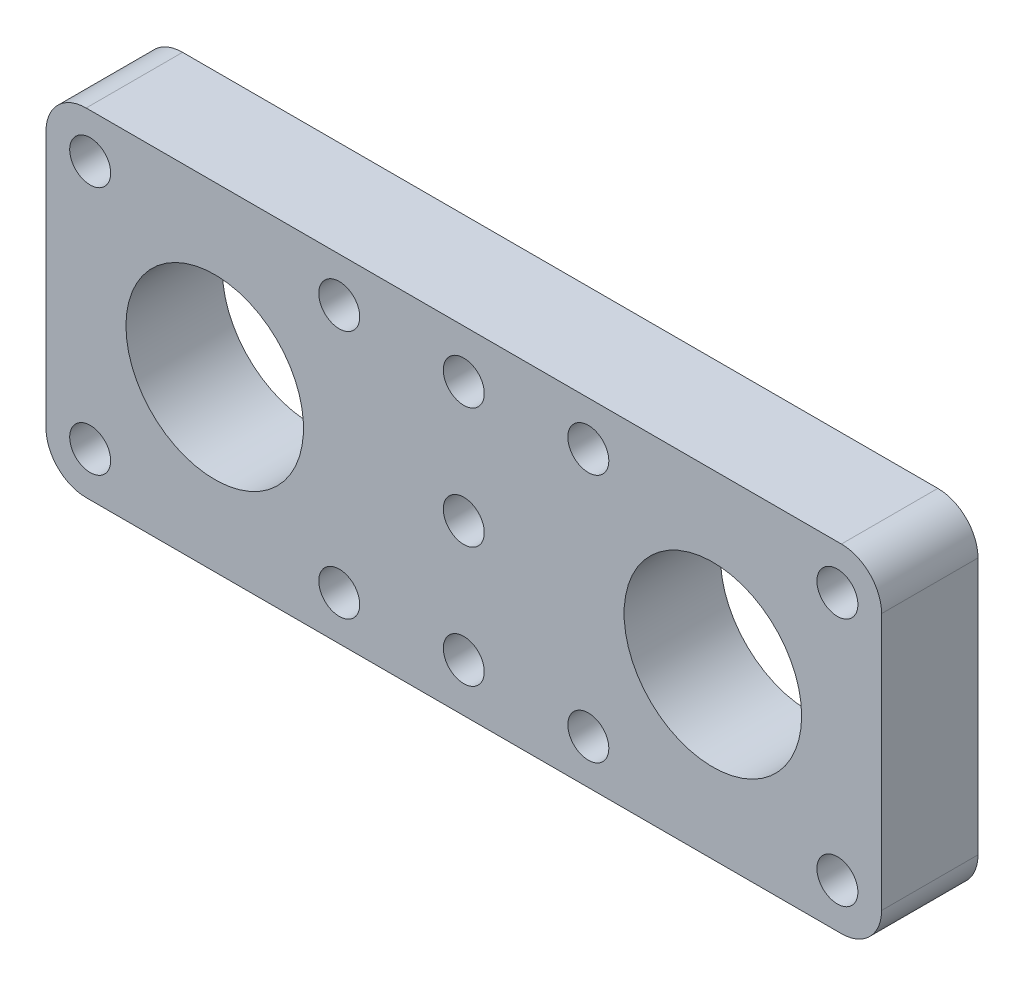
ISO-10303-21;
HEADER;
FILE_DESCRIPTION(('STEP AP214'),'2;1');
FILE_NAME('part.step','',(''),(''),'','','');
FILE_SCHEMA(('AUTOMOTIVE_DESIGN { 1 0 10303 214 1 1 1 1 }'));
ENDSEC;
DATA;
#1=APPLICATION_CONTEXT('core data for automotive mechanical design processes');
#2=APPLICATION_PROTOCOL_DEFINITION('international standard','automotive_design',2000,#1);
#3=PRODUCT_CONTEXT('',#1,'mechanical');
#4=PRODUCT('Part','Part','',(#3));
#5=PRODUCT_RELATED_PRODUCT_CATEGORY('part','',(#4));
#6=PRODUCT_DEFINITION_FORMATION('','',#4);
#7=PRODUCT_DEFINITION_CONTEXT('part definition',#1,'design');
#8=PRODUCT_DEFINITION('design','',#6,#7);
#9=PRODUCT_DEFINITION_SHAPE('','',#8);
#10=(LENGTH_UNIT() NAMED_UNIT(*) SI_UNIT(.MILLI.,.METRE.));
#11=(NAMED_UNIT(*) PLANE_ANGLE_UNIT() SI_UNIT($,.RADIAN.));
#12=(NAMED_UNIT(*) SI_UNIT($,.STERADIAN.) SOLID_ANGLE_UNIT());
#13=UNCERTAINTY_MEASURE_WITH_UNIT(LENGTH_MEASURE(1.E-05),#10,'distance_accuracy_value','');
#14=(GEOMETRIC_REPRESENTATION_CONTEXT(3) GLOBAL_UNCERTAINTY_ASSIGNED_CONTEXT((#13)) GLOBAL_UNIT_ASSIGNED_CONTEXT((#10,
#11,#12)) REPRESENTATION_CONTEXT('',''));
#15=CARTESIAN_POINT('',(0.,0.,0.));
#16=DIRECTION('',(0.,0.,1.));
#17=DIRECTION('',(1.,0.,0.));
#18=AXIS2_PLACEMENT_3D('',#15,#16,#17);
#19=CARTESIAN_POINT('',(10.0000001490116,0.,-7.));
#20=DIRECTION('',(0.,0.,1.));
#21=DIRECTION('',(1.,0.,0.));
#22=AXIS2_PLACEMENT_3D('',#19,#20,#21);
#23=PLANE('',#22);
#24=CARTESIAN_POINT('',(-15.5,-15.5,-7.));
#25=DIRECTION('',(0.,0.,1.));
#26=DIRECTION('',(1.,0.,0.));
#27=AXIS2_PLACEMENT_3D('',#24,#25,#26);
#28=CIRCLE('',#27,2.55);
#29=CARTESIAN_POINT('',(-12.95,-15.5,-7.));
#30=VERTEX_POINT('',#29);
#31=EDGE_CURVE('E288',#30,#30,#28,.T.);
#32=ORIENTED_EDGE('',*,*,#31,.T.);
#33=EDGE_LOOP('',(#32));
#34=FACE_BOUND('',#33,.T.);
#35=CARTESIAN_POINT('',(15.5,-15.5,-7.));
#36=DIRECTION('',(0.,0.,1.));
#37=DIRECTION('',(1.,0.,0.));
#38=AXIS2_PLACEMENT_3D('',#35,#36,#37);
#39=CIRCLE('',#38,2.55);
#40=CARTESIAN_POINT('',(18.05,-15.5,-7.));
#41=VERTEX_POINT('',#40);
#42=EDGE_CURVE('E293',#41,#41,#39,.T.);
#43=ORIENTED_EDGE('',*,*,#42,.T.);
#44=EDGE_LOOP('',(#43));
#45=FACE_BOUND('',#44,.T.);
#46=CARTESIAN_POINT('',(15.5,15.5,-7.));
#47=DIRECTION('',(0.,0.,1.));
#48=DIRECTION('',(1.,0.,0.));
#49=AXIS2_PLACEMENT_3D('',#46,#47,#48);
#50=CIRCLE('',#49,2.55);
#51=CARTESIAN_POINT('',(18.05,15.5,-7.));
#52=VERTEX_POINT('',#51);
#53=EDGE_CURVE('E298',#52,#52,#50,.T.);
#54=ORIENTED_EDGE('',*,*,#53,.T.);
#55=EDGE_LOOP('',(#54));
#56=FACE_BOUND('',#55,.T.);
#57=CARTESIAN_POINT('',(-15.5,15.5,-7.));
#58=DIRECTION('',(0.,0.,1.));
#59=DIRECTION('',(1.,0.,0.));
#60=AXIS2_PLACEMENT_3D('',#57,#58,#59);
#61=CIRCLE('',#60,2.55);
#62=CARTESIAN_POINT('',(-12.95,15.5,-7.));
#63=VERTEX_POINT('',#62);
#64=EDGE_CURVE('E303',#63,#63,#61,.T.);
#65=ORIENTED_EDGE('',*,*,#64,.T.);
#66=EDGE_LOOP('',(#65));
#67=FACE_BOUND('',#66,.T.);
#68=CARTESIAN_POINT('',(78.0000012367964,-16.0000003129244,-7.));
#69=DIRECTION('',(0.,0.,1.));
#70=DIRECTION('',(1.,0.,0.));
#71=AXIS2_PLACEMENT_3D('',#68,#69,#70);
#72=CIRCLE('',#71,5.);
#73=CARTESIAN_POINT('',(83.000000461936,-16.0000003129244,-7.));
#74=VERTEX_POINT('',#73);
#75=CARTESIAN_POINT('',(78.0000012367964,-21.0000003129244,-7.));
#76=VERTEX_POINT('',#75);
#77=EDGE_CURVE('E309',#74,#76,#72,.F.);
#78=ORIENTED_EDGE('',*,*,#77,.T.);
#79=DIRECTION('',(-1.,0.,0.));
#80=VECTOR('',#79,1.);
#81=CARTESIAN_POINT('',(21.0000003129244,-21.0000003129244,-7.));
#82=LINE('',#81,#80);
#83=CARTESIAN_POINT('',(-16.0000003129244,-21.0000003129244,-7.));
#84=VERTEX_POINT('',#83);
#85=EDGE_CURVE('E64',#76,#84,#82,.T.);
#86=ORIENTED_EDGE('',*,*,#85,.T.);
#87=CARTESIAN_POINT('',(-16.0000003129244,-16.0000003129244,-7.));
#88=DIRECTION('',(0.,0.,1.));
#89=DIRECTION('',(-0.707106781186548,-0.707106781186548,0.));
#90=AXIS2_PLACEMENT_3D('',#87,#88,#89);
#91=CIRCLE('',#90,5.);
#92=CARTESIAN_POINT('',(-21.0000003129244,-16.0000003129244,-7.));
#93=VERTEX_POINT('',#92);
#94=EDGE_CURVE('E271',#93,#84,#91,.T.);
#95=ORIENTED_EDGE('',*,*,#94,.F.);
#96=DIRECTION('',(0.,1.,0.));
#97=VECTOR('',#96,1.);
#98=CARTESIAN_POINT('',(-21.0000003129244,-21.0000003129244,-7.));
#99=LINE('',#98,#97);
#100=CARTESIAN_POINT('',(-21.0000003129244,16.0000003129244,-7.));
#101=VERTEX_POINT('',#100);
#102=EDGE_CURVE('E266',#93,#101,#99,.T.);
#103=ORIENTED_EDGE('',*,*,#102,.T.);
#104=CARTESIAN_POINT('',(-16.0000003129244,16.0000003129244,-7.));
#105=DIRECTION('',(0.,0.,1.));
#106=DIRECTION('',(-0.707106781186548,0.707106781186548,0.));
#107=AXIS2_PLACEMENT_3D('',#104,#105,#106);
#108=CIRCLE('',#107,5.);
#109=CARTESIAN_POINT('',(-16.0000003129244,21.0000003129244,-7.));
#110=VERTEX_POINT('',#109);
#111=EDGE_CURVE('E234',#110,#101,#108,.T.);
#112=ORIENTED_EDGE('',*,*,#111,.F.);
#113=DIRECTION('',(1.,0.,0.));
#114=VECTOR('',#113,1.);
#115=CARTESIAN_POINT('',(21.0000003129244,21.0000003129244,-7.));
#116=LINE('',#115,#114);
#117=CARTESIAN_POINT('',(78.0000012367964,21.0000003129244,-7.));
#118=VERTEX_POINT('',#117);
#119=EDGE_CURVE('E12',#110,#118,#116,.T.);
#120=ORIENTED_EDGE('',*,*,#119,.T.);
#121=CARTESIAN_POINT('',(78.0000012367964,16.0000003129244,-7.));
#122=DIRECTION('',(0.,0.,1.));
#123=DIRECTION('',(1.,0.,0.));
#124=AXIS2_PLACEMENT_3D('',#121,#122,#123);
#125=CIRCLE('',#124,5.00000000000001);
#126=CARTESIAN_POINT('',(83.000000461936,16.0000003129244,-7.));
#127=VERTEX_POINT('',#126);
#128=EDGE_CURVE('E314',#127,#118,#125,.T.);
#129=ORIENTED_EDGE('',*,*,#128,.F.);
#130=DIRECTION('',(0.,-1.,0.));
#131=VECTOR('',#130,1.);
#132=CARTESIAN_POINT('',(83.000000461936,0.,-7.));
#133=LINE('',#132,#131);
#134=EDGE_CURVE('E170',#127,#74,#133,.T.);
#135=ORIENTED_EDGE('',*,*,#134,.T.);
#136=EDGE_LOOP('',(#78,#86,#95,#103,#112,#120,#129,#135));
#137=FACE_BOUND('',#136,.T.);
#138=CARTESIAN_POINT('',(31.000000461936,15.0000002235174,-7.));
#139=DIRECTION('',(0.,0.,-1.));
#140=DIRECTION('',(1.,0.,0.));
#141=AXIS2_PLACEMENT_3D('',#138,#139,#140);
#142=CIRCLE('',#141,2.55);
#143=CARTESIAN_POINT('',(28.450000461936,15.0000002235174,-7.));
#144=VERTEX_POINT('',#143);
#145=EDGE_CURVE('E279',#144,#144,#142,.T.);
#146=ORIENTED_EDGE('',*,*,#145,.F.);
#147=EDGE_LOOP('',(#146));
#148=FACE_BOUND('',#147,.T.);
#149=CARTESIAN_POINT('',(31.000000461936,2.23517417907715E-07,-7.));
#150=DIRECTION('',(0.,0.,-1.));
#151=DIRECTION('',(1.,0.,0.));
#152=AXIS2_PLACEMENT_3D('',#149,#150,#151);
#153=CIRCLE('',#152,2.55);
#154=CARTESIAN_POINT('',(28.450000461936,2.2351741759543E-07,-7.));
#155=VERTEX_POINT('',#154);
#156=EDGE_CURVE('E284',#155,#155,#153,.T.);
#157=ORIENTED_EDGE('',*,*,#156,.F.);
#158=EDGE_LOOP('',(#157));
#159=FACE_BOUND('',#158,.T.);
#160=CARTESIAN_POINT('',(0.,0.,-7.));
#161=DIRECTION('',(0.,0.,-1.));
#162=DIRECTION('',(1.,0.,0.));
#163=AXIS2_PLACEMENT_3D('',#160,#161,#162);
#164=CIRCLE('',#163,11.05);
#165=CARTESIAN_POINT('',(-11.05,0.,-7.));
#166=VERTEX_POINT('',#165);
#167=EDGE_CURVE('E85',#166,#166,#164,.T.);
#168=ORIENTED_EDGE('',*,*,#167,.F.);
#169=EDGE_LOOP('',(#168));
#170=FACE_BOUND('',#169,.T.);
#171=CARTESIAN_POINT('',(31.000000461936,-14.9999997764826,-7.));
#172=DIRECTION('',(0.,0.,-1.));
#173=DIRECTION('',(1.,0.,0.));
#174=AXIS2_PLACEMENT_3D('',#171,#172,#173);
#175=CIRCLE('',#174,2.55);
#176=CARTESIAN_POINT('',(28.450000461936,-14.9999997764826,-7.));
#177=VERTEX_POINT('',#176);
#178=EDGE_CURVE('E76',#177,#177,#175,.T.);
#179=ORIENTED_EDGE('',*,*,#178,.F.);
#180=EDGE_LOOP('',(#179));
#181=FACE_BOUND('',#180,.T.);
#182=CARTESIAN_POINT('',(46.500000923872,15.5,-7.));
#183=DIRECTION('',(0.,0.,1.));
#184=DIRECTION('',(1.,0.,0.));
#185=AXIS2_PLACEMENT_3D('',#182,#183,#184);
#186=CIRCLE('',#185,2.55);
#187=CARTESIAN_POINT('',(49.050000923872,15.5,-7.));
#188=VERTEX_POINT('',#187);
#189=EDGE_CURVE('E210',#188,#188,#186,.F.);
#190=ORIENTED_EDGE('',*,*,#189,.F.);
#191=EDGE_LOOP('',(#190));
#192=FACE_BOUND('',#191,.T.);
#193=CARTESIAN_POINT('',(77.500000923872,-15.5,-7.));
#194=DIRECTION('',(0.,0.,1.));
#195=DIRECTION('',(1.,0.,0.));
#196=AXIS2_PLACEMENT_3D('',#193,#194,#195);
#197=CIRCLE('',#196,2.54999999999999);
#198=CARTESIAN_POINT('',(80.050000923872,-15.5,-7.));
#199=VERTEX_POINT('',#198);
#200=EDGE_CURVE('E317',#199,#199,#197,.F.);
#201=ORIENTED_EDGE('',*,*,#200,.F.);
#202=EDGE_LOOP('',(#201));
#203=FACE_BOUND('',#202,.T.);
#204=CARTESIAN_POINT('',(46.500000923872,-15.5,-7.));
#205=DIRECTION('',(0.,0.,1.));
#206=DIRECTION('',(1.,0.,0.));
#207=AXIS2_PLACEMENT_3D('',#204,#205,#206);
#208=CIRCLE('',#207,2.55);
#209=CARTESIAN_POINT('',(49.050000923872,-15.5,-7.));
#210=VERTEX_POINT('',#209);
#211=EDGE_CURVE('E313',#210,#210,#208,.F.);
#212=ORIENTED_EDGE('',*,*,#211,.F.);
#213=EDGE_LOOP('',(#212));
#214=FACE_BOUND('',#213,.T.);
#215=CARTESIAN_POINT('',(77.500000923872,15.5,-7.));
#216=DIRECTION('',(0.,0.,1.));
#217=DIRECTION('',(1.,0.,0.));
#218=AXIS2_PLACEMENT_3D('',#215,#216,#217);
#219=CIRCLE('',#218,2.54999999999999);
#220=CARTESIAN_POINT('',(80.050000923872,15.5,-7.));
#221=VERTEX_POINT('',#220);
#222=EDGE_CURVE('E346',#221,#221,#219,.F.);
#223=ORIENTED_EDGE('',*,*,#222,.F.);
#224=EDGE_LOOP('',(#223));
#225=FACE_BOUND('',#224,.T.);
#226=CARTESIAN_POINT('',(62.000000923872,0.,-7.));
#227=DIRECTION('',(0.,0.,1.));
#228=DIRECTION('',(1.,0.,0.));
#229=AXIS2_PLACEMENT_3D('',#226,#227,#228);
#230=CIRCLE('',#229,11.05);
#231=CARTESIAN_POINT('',(73.050000923872,0.,-7.));
#232=VERTEX_POINT('',#231);
#233=EDGE_CURVE('E58',#232,#232,#230,.F.);
#234=ORIENTED_EDGE('',*,*,#233,.F.);
#235=EDGE_LOOP('',(#234));
#236=FACE_BOUND('',#235,.T.);
#237=ADVANCED_FACE('F55',(#34,#45,#56,#67,#137,#148,#159,#170,#181,#192,#203,#214,#225,#236),
#23,.F.);
#238=CARTESIAN_POINT('',(41.0000006109476,21.0000003129244,0.));
#239=DIRECTION('',(0.,1.,0.));
#240=DIRECTION('',(1.,0.,0.));
#241=AXIS2_PLACEMENT_3D('',#238,#239,#240);
#242=PLANE('',#241);
#243=DIRECTION('',(0.,0.,-1.));
#244=VECTOR('',#243,1.);
#245=CARTESIAN_POINT('',(-16.0000003129244,21.0000003129244,0.));
#246=LINE('',#245,#244);
#247=CARTESIAN_POINT('',(-16.0000003129244,21.0000003129244,5.));
#248=VERTEX_POINT('',#247);
#249=EDGE_CURVE('E230',#248,#110,#246,.T.);
#250=ORIENTED_EDGE('',*,*,#249,.F.);
#251=DIRECTION('',(-1.,0.,0.));
#252=VECTOR('',#251,1.);
#253=CARTESIAN_POINT('',(21.0000003129244,21.0000003129244,5.));
#254=LINE('',#253,#252);
#255=CARTESIAN_POINT('',(78.0000012367964,21.0000003129244,5.));
#256=VERTEX_POINT('',#255);
#257=EDGE_CURVE('E226',#256,#248,#254,.T.);
#258=ORIENTED_EDGE('',*,*,#257,.F.);
#259=DIRECTION('',(0.,0.,1.));
#260=VECTOR('',#259,1.);
#261=CARTESIAN_POINT('',(78.0000012367964,21.0000003129244,0.));
#262=LINE('',#261,#260);
#263=EDGE_CURVE('E176',#118,#256,#262,.T.);
#264=ORIENTED_EDGE('',*,*,#263,.F.);
#265=ORIENTED_EDGE('',*,*,#119,.F.);
#266=EDGE_LOOP('',(#250,#258,#264,#265));
#267=FACE_BOUND('',#266,.T.);
#268=ADVANCED_FACE('F359',(#267),#242,.T.);
#269=CARTESIAN_POINT('',(-21.0000003129244,-21.0000003129244,0.));
#270=DIRECTION('',(0.,-1.,0.));
#271=DIRECTION('',(0.,0.,-1.));
#272=AXIS2_PLACEMENT_3D('',#269,#270,#271);
#273=PLANE('',#272);
#274=DIRECTION('',(0.,0.,1.));
#275=VECTOR('',#274,1.);
#276=CARTESIAN_POINT('',(-16.0000003129244,-21.0000003129244,0.));
#277=LINE('',#276,#275);
#278=CARTESIAN_POINT('',(-16.0000003129244,-21.0000003129244,5.));
#279=VERTEX_POINT('',#278);
#280=EDGE_CURVE('E272',#84,#279,#277,.T.);
#281=ORIENTED_EDGE('',*,*,#280,.F.);
#282=ORIENTED_EDGE('',*,*,#85,.F.);
#283=DIRECTION('',(0.,0.,1.));
#284=VECTOR('',#283,1.);
#285=CARTESIAN_POINT('',(78.0000012367964,-21.0000003129244,0.));
#286=LINE('',#285,#284);
#287=CARTESIAN_POINT('',(78.0000012367964,-21.0000003129244,5.));
#288=VERTEX_POINT('',#287);
#289=EDGE_CURVE('E215',#76,#288,#286,.T.);
#290=ORIENTED_EDGE('',*,*,#289,.T.);
#291=DIRECTION('',(1.,0.,0.));
#292=VECTOR('',#291,1.);
#293=CARTESIAN_POINT('',(21.0000003129244,-21.0000003129244,5.));
#294=LINE('',#293,#292);
#295=EDGE_CURVE('E251',#279,#288,#294,.T.);
#296=ORIENTED_EDGE('',*,*,#295,.F.);
#297=EDGE_LOOP('',(#281,#282,#290,#296));
#298=FACE_BOUND('',#297,.T.);
#299=ADVANCED_FACE('F365',(#298),#273,.T.);
#300=CARTESIAN_POINT('',(31.000000461936,-14.9999997764826,0.));
#301=DIRECTION('',(0.,0.,1.));
#302=DIRECTION('',(1.,0.,0.));
#303=AXIS2_PLACEMENT_3D('',#300,#301,#302);
#304=CYLINDRICAL_SURFACE('',#303,2.55);
#305=CARTESIAN_POINT('',(31.000000461936,-14.9999997764826,5.));
#306=DIRECTION('',(0.,0.,-1.));
#307=DIRECTION('',(1.,0.,0.));
#308=AXIS2_PLACEMENT_3D('',#305,#306,#307);
#309=CIRCLE('',#308,2.55);
#310=CARTESIAN_POINT('',(28.450000461936,-14.9999997764826,5.));
#311=VERTEX_POINT('',#310);
#312=EDGE_CURVE('E221',#311,#311,#309,.T.);
#313=ORIENTED_EDGE('',*,*,#312,.F.);
#314=DIRECTION('',(0.,0.,-1.));
#315=VECTOR('',#314,1.);
#316=CARTESIAN_POINT('',(28.450000461936,-14.9999997764826,0.));
#317=LINE('',#316,#315);
#318=EDGE_CURVE('E240',#311,#177,#317,.T.);
#319=ORIENTED_EDGE('',*,*,#318,.T.);
#320=ORIENTED_EDGE('',*,*,#178,.T.);
#321=ORIENTED_EDGE('',*,*,#318,.F.);
#322=EDGE_LOOP('',(#313,#319,#320,#321));
#323=FACE_BOUND('',#322,.T.);
#324=ADVANCED_FACE('F447',(#323),#304,.F.);
#325=CARTESIAN_POINT('',(0.,0.,0.));
#326=DIRECTION('',(0.,0.,1.));
#327=DIRECTION('',(1.,0.,0.));
#328=AXIS2_PLACEMENT_3D('',#325,#326,#327);
#329=CYLINDRICAL_SURFACE('',#328,11.05);
#330=CARTESIAN_POINT('',(0.,0.,5.));
#331=DIRECTION('',(0.,0.,-1.));
#332=DIRECTION('',(1.,0.,0.));
#333=AXIS2_PLACEMENT_3D('',#330,#331,#332);
#334=CIRCLE('',#333,11.05);
#335=CARTESIAN_POINT('',(-11.05,0.,5.));
#336=VERTEX_POINT('',#335);
#337=EDGE_CURVE('E225',#336,#336,#334,.T.);
#338=ORIENTED_EDGE('',*,*,#337,.F.);
#339=DIRECTION('',(0.,0.,-1.));
#340=VECTOR('',#339,1.);
#341=CARTESIAN_POINT('',(-11.05,0.,0.));
#342=LINE('',#341,#340);
#343=EDGE_CURVE('E285',#336,#166,#342,.T.);
#344=ORIENTED_EDGE('',*,*,#343,.T.);
#345=ORIENTED_EDGE('',*,*,#167,.T.);
#346=ORIENTED_EDGE('',*,*,#343,.F.);
#347=EDGE_LOOP('',(#338,#344,#345,#346));
#348=FACE_BOUND('',#347,.T.);
#349=ADVANCED_FACE('F453',(#348),#329,.F.);
#350=CARTESIAN_POINT('',(31.000000461936,2.23517417907715E-07,0.));
#351=DIRECTION('',(0.,0.,1.));
#352=DIRECTION('',(1.,0.,0.));
#353=AXIS2_PLACEMENT_3D('',#350,#351,#352);
#354=CYLINDRICAL_SURFACE('',#353,2.55);
#355=CARTESIAN_POINT('',(31.000000461936,2.23517417907715E-07,5.));
#356=DIRECTION('',(0.,0.,-1.));
#357=DIRECTION('',(1.,0.,0.));
#358=AXIS2_PLACEMENT_3D('',#355,#356,#357);
#359=CIRCLE('',#358,2.55);
#360=CARTESIAN_POINT('',(28.450000461936,2.23517417907715E-07,5.));
#361=VERTEX_POINT('',#360);
#362=EDGE_CURVE('E246',#361,#361,#359,.T.);
#363=ORIENTED_EDGE('',*,*,#362,.F.);
#364=DIRECTION('',(0.,0.,-1.));
#365=VECTOR('',#364,1.);
#366=CARTESIAN_POINT('',(28.450000461936,2.2351741759543E-07,0.));
#367=LINE('',#366,#365);
#368=EDGE_CURVE('E280',#361,#155,#367,.T.);
#369=ORIENTED_EDGE('',*,*,#368,.T.);
#370=ORIENTED_EDGE('',*,*,#156,.T.);
#371=ORIENTED_EDGE('',*,*,#368,.F.);
#372=EDGE_LOOP('',(#363,#369,#370,#371));
#373=FACE_BOUND('',#372,.T.);
#374=ADVANCED_FACE('F451',(#373),#354,.F.);
#375=CARTESIAN_POINT('',(31.000000461936,15.0000002235174,0.));
#376=DIRECTION('',(0.,0.,1.));
#377=DIRECTION('',(1.,0.,0.));
#378=AXIS2_PLACEMENT_3D('',#375,#376,#377);
#379=CYLINDRICAL_SURFACE('',#378,2.55);
#380=CARTESIAN_POINT('',(31.000000461936,15.0000002235174,5.));
#381=DIRECTION('',(0.,0.,-1.));
#382=DIRECTION('',(1.,0.,0.));
#383=AXIS2_PLACEMENT_3D('',#380,#381,#382);
#384=CIRCLE('',#383,2.55);
#385=CARTESIAN_POINT('',(28.450000461936,15.0000002235174,5.));
#386=VERTEX_POINT('',#385);
#387=EDGE_CURVE('E262',#386,#386,#384,.T.);
#388=ORIENTED_EDGE('',*,*,#387,.F.);
#389=DIRECTION('',(0.,0.,-1.));
#390=VECTOR('',#389,1.);
#391=CARTESIAN_POINT('',(28.450000461936,15.0000002235174,0.));
#392=LINE('',#391,#390);
#393=EDGE_CURVE('E275',#386,#144,#392,.T.);
#394=ORIENTED_EDGE('',*,*,#393,.T.);
#395=ORIENTED_EDGE('',*,*,#145,.T.);
#396=ORIENTED_EDGE('',*,*,#393,.F.);
#397=EDGE_LOOP('',(#388,#394,#395,#396));
#398=FACE_BOUND('',#397,.T.);
#399=ADVANCED_FACE('F442',(#398),#379,.F.);
#400=CARTESIAN_POINT('',(-16.0000003129244,-16.0000003129244,0.));
#401=DIRECTION('',(0.,0.,1.));
#402=DIRECTION('',(-0.707106781186548,-0.707106781186548,0.));
#403=AXIS2_PLACEMENT_3D('',#400,#401,#402);
#404=CYLINDRICAL_SURFACE('',#403,5.);
#405=CARTESIAN_POINT('',(-16.0000003129244,-16.0000003129244,5.));
#406=DIRECTION('',(0.,0.,-1.));
#407=DIRECTION('',(-0.707106781186548,-0.707106781186548,0.));
#408=AXIS2_PLACEMENT_3D('',#405,#406,#407);
#409=CIRCLE('',#408,5.);
#410=CARTESIAN_POINT('',(-21.0000003129244,-16.0000003129244,5.));
#411=VERTEX_POINT('',#410);
#412=EDGE_CURVE('E250',#279,#411,#409,.T.);
#413=ORIENTED_EDGE('',*,*,#412,.T.);
#414=DIRECTION('',(0.,0.,-1.));
#415=VECTOR('',#414,1.);
#416=CARTESIAN_POINT('',(-21.0000003129244,-16.0000003129244,0.));
#417=LINE('',#416,#415);
#418=EDGE_CURVE('E267',#411,#93,#417,.T.);
#419=ORIENTED_EDGE('',*,*,#418,.T.);
#420=ORIENTED_EDGE('',*,*,#94,.T.);
#421=ORIENTED_EDGE('',*,*,#280,.T.);
#422=EDGE_LOOP('',(#413,#419,#420,#421));
#423=FACE_BOUND('',#422,.T.);
#424=ADVANCED_FACE('F436',(#423),#404,.T.);
#425=CARTESIAN_POINT('',(-21.0000003129244,21.0000003129244,0.));
#426=DIRECTION('',(-1.,0.,0.));
#427=DIRECTION('',(0.,0.,1.));
#428=AXIS2_PLACEMENT_3D('',#425,#426,#427);
#429=PLANE('',#428);
#430=DIRECTION('',(0.,0.,1.));
#431=VECTOR('',#430,1.);
#432=CARTESIAN_POINT('',(-21.0000003129244,16.0000003129244,0.));
#433=LINE('',#432,#431);
#434=CARTESIAN_POINT('',(-21.0000003129244,16.0000003129244,5.));
#435=VERTEX_POINT('',#434);
#436=EDGE_CURVE('E235',#101,#435,#433,.T.);
#437=ORIENTED_EDGE('',*,*,#436,.F.);
#438=ORIENTED_EDGE('',*,*,#102,.F.);
#439=ORIENTED_EDGE('',*,*,#418,.F.);
#440=DIRECTION('',(0.,-1.,0.));
#441=VECTOR('',#440,1.);
#442=CARTESIAN_POINT('',(-21.0000003129244,-21.0000003129244,5.));
#443=LINE('',#442,#441);
#444=EDGE_CURVE('E239',#435,#411,#443,.T.);
#445=ORIENTED_EDGE('',*,*,#444,.F.);
#446=EDGE_LOOP('',(#437,#438,#439,#445));
#447=FACE_BOUND('',#446,.T.);
#448=ADVANCED_FACE('F399',(#447),#429,.T.);
#449=CARTESIAN_POINT('',(10.0000001490116,0.,5.));
#450=DIRECTION('',(0.,0.,1.));
#451=DIRECTION('',(1.,0.,0.));
#452=AXIS2_PLACEMENT_3D('',#449,#450,#451);
#453=PLANE('',#452);
#454=CARTESIAN_POINT('',(-15.5,-15.5,5.));
#455=DIRECTION('',(0.,0.,1.));
#456=DIRECTION('',(1.,0.,0.));
#457=AXIS2_PLACEMENT_3D('',#454,#455,#456);
#458=CIRCLE('',#457,2.55);
#459=CARTESIAN_POINT('',(-12.95,-15.5,5.));
#460=VERTEX_POINT('',#459);
#461=EDGE_CURVE('E292',#460,#460,#458,.T.);
#462=ORIENTED_EDGE('',*,*,#461,.F.);
#463=EDGE_LOOP('',(#462));
#464=FACE_BOUND('',#463,.T.);
#465=CARTESIAN_POINT('',(15.5,-15.5,5.));
#466=DIRECTION('',(0.,0.,1.));
#467=DIRECTION('',(1.,0.,0.));
#468=AXIS2_PLACEMENT_3D('',#465,#466,#467);
#469=CIRCLE('',#468,2.55);
#470=CARTESIAN_POINT('',(18.05,-15.5,5.));
#471=VERTEX_POINT('',#470);
#472=EDGE_CURVE('E297',#471,#471,#469,.T.);
#473=ORIENTED_EDGE('',*,*,#472,.F.);
#474=EDGE_LOOP('',(#473));
#475=FACE_BOUND('',#474,.T.);
#476=CARTESIAN_POINT('',(15.5,15.5,5.));
#477=DIRECTION('',(0.,0.,1.));
#478=DIRECTION('',(1.,0.,0.));
#479=AXIS2_PLACEMENT_3D('',#476,#477,#478);
#480=CIRCLE('',#479,2.55);
#481=CARTESIAN_POINT('',(18.05,15.5,5.));
#482=VERTEX_POINT('',#481);
#483=EDGE_CURVE('E302',#482,#482,#480,.T.);
#484=ORIENTED_EDGE('',*,*,#483,.F.);
#485=EDGE_LOOP('',(#484));
#486=FACE_BOUND('',#485,.T.);
#487=CARTESIAN_POINT('',(-15.5,15.5,5.));
#488=DIRECTION('',(0.,0.,1.));
#489=DIRECTION('',(1.,0.,0.));
#490=AXIS2_PLACEMENT_3D('',#487,#488,#489);
#491=CIRCLE('',#490,2.55);
#492=CARTESIAN_POINT('',(-12.95,15.5,5.));
#493=VERTEX_POINT('',#492);
#494=EDGE_CURVE('E308',#493,#493,#491,.T.);
#495=ORIENTED_EDGE('',*,*,#494,.F.);
#496=EDGE_LOOP('',(#495));
#497=FACE_BOUND('',#496,.T.);
#498=ORIENTED_EDGE('',*,*,#295,.T.);
#499=CARTESIAN_POINT('',(78.0000012367964,-16.0000003129244,5.));
#500=DIRECTION('',(0.,0.,1.));
#501=DIRECTION('',(1.,0.,0.));
#502=AXIS2_PLACEMENT_3D('',#499,#500,#501);
#503=CIRCLE('',#502,5.);
#504=CARTESIAN_POINT('',(83.000000461936,-16.0000003129244,5.));
#505=VERTEX_POINT('',#504);
#506=EDGE_CURVE('E184',#505,#288,#503,.F.);
#507=ORIENTED_EDGE('',*,*,#506,.F.);
#508=DIRECTION('',(0.,-1.,0.));
#509=VECTOR('',#508,1.);
#510=CARTESIAN_POINT('',(83.000000461936,0.,5.));
#511=LINE('',#510,#509);
#512=CARTESIAN_POINT('',(83.000000461936,16.0000003129244,5.));
#513=VERTEX_POINT('',#512);
#514=EDGE_CURVE('E168',#513,#505,#511,.T.);
#515=ORIENTED_EDGE('',*,*,#514,.F.);
#516=CARTESIAN_POINT('',(78.0000012367964,16.0000003129244,5.));
#517=DIRECTION('',(0.,0.,1.));
#518=DIRECTION('',(1.,0.,0.));
#519=AXIS2_PLACEMENT_3D('',#516,#517,#518);
#520=CIRCLE('',#519,5.00000000000001);
#521=EDGE_CURVE('E182',#513,#256,#520,.T.);
#522=ORIENTED_EDGE('',*,*,#521,.T.);
#523=ORIENTED_EDGE('',*,*,#257,.T.);
#524=CARTESIAN_POINT('',(-16.0000003129244,16.0000003129244,5.));
#525=DIRECTION('',(0.,0.,-1.));
#526=DIRECTION('',(-0.707106781186548,0.707106781186548,0.));
#527=AXIS2_PLACEMENT_3D('',#524,#525,#526);
#528=CIRCLE('',#527,5.);
#529=EDGE_CURVE('E214',#435,#248,#528,.T.);
#530=ORIENTED_EDGE('',*,*,#529,.F.);
#531=ORIENTED_EDGE('',*,*,#444,.T.);
#532=ORIENTED_EDGE('',*,*,#412,.F.);
#533=EDGE_LOOP('',(#498,#507,#515,#522,#523,#530,#531,#532));
#534=FACE_BOUND('',#533,.T.);
#535=ORIENTED_EDGE('',*,*,#387,.T.);
#536=EDGE_LOOP('',(#535));
#537=FACE_BOUND('',#536,.T.);
#538=ORIENTED_EDGE('',*,*,#362,.T.);
#539=EDGE_LOOP('',(#538));
#540=FACE_BOUND('',#539,.T.);
#541=ORIENTED_EDGE('',*,*,#337,.T.);
#542=EDGE_LOOP('',(#541));
#543=FACE_BOUND('',#542,.T.);
#544=ORIENTED_EDGE('',*,*,#312,.T.);
#545=EDGE_LOOP('',(#544));
#546=FACE_BOUND('',#545,.T.);
#547=CARTESIAN_POINT('',(46.500000923872,15.5,5.));
#548=DIRECTION('',(0.,0.,1.));
#549=DIRECTION('',(1.,0.,0.));
#550=AXIS2_PLACEMENT_3D('',#547,#548,#549);
#551=CIRCLE('',#550,2.55);
#552=CARTESIAN_POINT('',(49.050000923872,15.5,5.));
#553=VERTEX_POINT('',#552);
#554=EDGE_CURVE('E307',#553,#553,#551,.F.);
#555=ORIENTED_EDGE('',*,*,#554,.T.);
#556=EDGE_LOOP('',(#555));
#557=FACE_BOUND('',#556,.T.);
#558=CARTESIAN_POINT('',(77.500000923872,-15.5,5.));
#559=DIRECTION('',(0.,0.,1.));
#560=DIRECTION('',(1.,0.,0.));
#561=AXIS2_PLACEMENT_3D('',#558,#559,#560);
#562=CIRCLE('',#561,2.54999999999999);
#563=CARTESIAN_POINT('',(80.050000923872,-15.5,5.));
#564=VERTEX_POINT('',#563);
#565=EDGE_CURVE('E187',#564,#564,#562,.F.);
#566=ORIENTED_EDGE('',*,*,#565,.T.);
#567=EDGE_LOOP('',(#566));
#568=FACE_BOUND('',#567,.T.);
#569=CARTESIAN_POINT('',(46.500000923872,-15.5,5.));
#570=DIRECTION('',(0.,0.,1.));
#571=DIRECTION('',(1.,0.,0.));
#572=AXIS2_PLACEMENT_3D('',#569,#570,#571);
#573=CIRCLE('',#572,2.55);
#574=CARTESIAN_POINT('',(49.050000923872,-15.5,5.));
#575=VERTEX_POINT('',#574);
#576=EDGE_CURVE('E195',#575,#575,#573,.F.);
#577=ORIENTED_EDGE('',*,*,#576,.T.);
#578=EDGE_LOOP('',(#577));
#579=FACE_BOUND('',#578,.T.);
#580=CARTESIAN_POINT('',(77.500000923872,15.5,5.));
#581=DIRECTION('',(0.,0.,1.));
#582=DIRECTION('',(1.,0.,0.));
#583=AXIS2_PLACEMENT_3D('',#580,#581,#582);
#584=CIRCLE('',#583,2.54999999999999);
#585=CARTESIAN_POINT('',(80.050000923872,15.5,5.));
#586=VERTEX_POINT('',#585);
#587=EDGE_CURVE('E202',#586,#586,#584,.F.);
#588=ORIENTED_EDGE('',*,*,#587,.T.);
#589=EDGE_LOOP('',(#588));
#590=FACE_BOUND('',#589,.T.);
#591=CARTESIAN_POINT('',(62.000000923872,0.,5.));
#592=DIRECTION('',(0.,0.,1.));
#593=DIRECTION('',(1.,0.,0.));
#594=AXIS2_PLACEMENT_3D('',#591,#592,#593);
#595=CIRCLE('',#594,11.05);
#596=CARTESIAN_POINT('',(73.050000923872,0.,5.));
#597=VERTEX_POINT('',#596);
#598=EDGE_CURVE('E206',#597,#597,#595,.F.);
#599=ORIENTED_EDGE('',*,*,#598,.T.);
#600=EDGE_LOOP('',(#599));
#601=FACE_BOUND('',#600,.T.);
#602=ADVANCED_FACE('F180',(#464,#475,#486,#497,#534,#537,#540,#543,#546,#557,#568,#579,#590,
#601),#453,.T.);
#603=CARTESIAN_POINT('',(-16.0000003129244,16.0000003129244,0.));
#604=DIRECTION('',(0.,0.,1.));
#605=DIRECTION('',(-0.707106781186548,0.707106781186548,0.));
#606=AXIS2_PLACEMENT_3D('',#603,#604,#605);
#607=CYLINDRICAL_SURFACE('',#606,5.);
#608=ORIENTED_EDGE('',*,*,#529,.T.);
#609=ORIENTED_EDGE('',*,*,#249,.T.);
#610=ORIENTED_EDGE('',*,*,#111,.T.);
#611=ORIENTED_EDGE('',*,*,#436,.T.);
#612=EDGE_LOOP('',(#608,#609,#610,#611));
#613=FACE_BOUND('',#612,.T.);
#614=ADVANCED_FACE('F398',(#613),#607,.T.);
#615=CARTESIAN_POINT('',(83.000000461936,0.,0.));
#616=DIRECTION('',(-1.,0.,0.));
#617=DIRECTION('',(0.,0.,1.));
#618=AXIS2_PLACEMENT_3D('',#615,#616,#617);
#619=PLANE('',#618);
#620=ORIENTED_EDGE('',*,*,#514,.T.);
#621=DIRECTION('',(0.,0.,1.));
#622=VECTOR('',#621,1.);
#623=CARTESIAN_POINT('',(83.000000461936,-16.0000003129244,0.));
#624=LINE('',#623,#622);
#625=EDGE_CURVE('E211',#74,#505,#624,.T.);
#626=ORIENTED_EDGE('',*,*,#625,.F.);
#627=ORIENTED_EDGE('',*,*,#134,.F.);
#628=DIRECTION('',(0.,0.,1.));
#629=VECTOR('',#628,1.);
#630=CARTESIAN_POINT('',(83.000000461936,16.0000003129244,0.));
#631=LINE('',#630,#629);
#632=EDGE_CURVE('E164',#127,#513,#631,.T.);
#633=ORIENTED_EDGE('',*,*,#632,.T.);
#634=EDGE_LOOP('',(#620,#626,#627,#633));
#635=FACE_BOUND('',#634,.T.);
#636=ADVANCED_FACE('F166',(#635),#619,.F.);
#637=CARTESIAN_POINT('',(78.0000012367964,-16.0000003129244,0.));
#638=DIRECTION('',(0.,0.,1.));
#639=DIRECTION('',(1.,0.,0.));
#640=AXIS2_PLACEMENT_3D('',#637,#638,#639);
#641=CYLINDRICAL_SURFACE('',#640,5.);
#642=ORIENTED_EDGE('',*,*,#506,.T.);
#643=ORIENTED_EDGE('',*,*,#289,.F.);
#644=ORIENTED_EDGE('',*,*,#77,.F.);
#645=ORIENTED_EDGE('',*,*,#625,.T.);
#646=EDGE_LOOP('',(#642,#643,#644,#645));
#647=FACE_BOUND('',#646,.T.);
#648=ADVANCED_FACE('F422',(#647),#641,.T.);
#649=CARTESIAN_POINT('',(77.500000923872,15.5,0.));
#650=DIRECTION('',(0.,0.,1.));
#651=DIRECTION('',(1.,0.,0.));
#652=AXIS2_PLACEMENT_3D('',#649,#650,#651);
#653=CYLINDRICAL_SURFACE('',#652,2.54999999999999);
#654=ORIENTED_EDGE('',*,*,#222,.T.);
#655=EDGE_LOOP('',(#654));
#656=FACE_BOUND('',#655,.T.);
#657=ORIENTED_EDGE('',*,*,#587,.F.);
#658=EDGE_LOOP('',(#657));
#659=FACE_BOUND('',#658,.T.);
#660=ADVANCED_FACE('F393',(#656,#659),#653,.F.);
#661=CARTESIAN_POINT('',(46.500000923872,-15.5,0.));
#662=DIRECTION('',(0.,0.,1.));
#663=DIRECTION('',(1.,0.,0.));
#664=AXIS2_PLACEMENT_3D('',#661,#662,#663);
#665=CYLINDRICAL_SURFACE('',#664,2.55);
#666=ORIENTED_EDGE('',*,*,#211,.T.);
#667=EDGE_LOOP('',(#666));
#668=FACE_BOUND('',#667,.T.);
#669=ORIENTED_EDGE('',*,*,#576,.F.);
#670=EDGE_LOOP('',(#669));
#671=FACE_BOUND('',#670,.T.);
#672=ADVANCED_FACE('F390',(#668,#671),#665,.F.);
#673=CARTESIAN_POINT('',(78.0000012367964,16.0000003129244,0.));
#674=DIRECTION('',(0.,0.,1.));
#675=DIRECTION('',(1.,0.,0.));
#676=AXIS2_PLACEMENT_3D('',#673,#674,#675);
#677=CYLINDRICAL_SURFACE('',#676,5.00000000000001);
#678=ORIENTED_EDGE('',*,*,#521,.F.);
#679=ORIENTED_EDGE('',*,*,#632,.F.);
#680=ORIENTED_EDGE('',*,*,#128,.T.);
#681=ORIENTED_EDGE('',*,*,#263,.T.);
#682=EDGE_LOOP('',(#678,#679,#680,#681));
#683=FACE_BOUND('',#682,.T.);
#684=ADVANCED_FACE('F190',(#683),#677,.T.);
#685=CARTESIAN_POINT('',(77.500000923872,-15.5,0.));
#686=DIRECTION('',(0.,0.,1.));
#687=DIRECTION('',(1.,0.,0.));
#688=AXIS2_PLACEMENT_3D('',#685,#686,#687);
#689=CYLINDRICAL_SURFACE('',#688,2.54999999999999);
#690=ORIENTED_EDGE('',*,*,#200,.T.);
#691=EDGE_LOOP('',(#690));
#692=FACE_BOUND('',#691,.T.);
#693=ORIENTED_EDGE('',*,*,#565,.F.);
#694=EDGE_LOOP('',(#693));
#695=FACE_BOUND('',#694,.T.);
#696=ADVANCED_FACE('F416',(#692,#695),#689,.F.);
#697=CARTESIAN_POINT('',(46.500000923872,15.5,0.));
#698=DIRECTION('',(0.,0.,1.));
#699=DIRECTION('',(1.,0.,0.));
#700=AXIS2_PLACEMENT_3D('',#697,#698,#699);
#701=CYLINDRICAL_SURFACE('',#700,2.55);
#702=ORIENTED_EDGE('',*,*,#189,.T.);
#703=EDGE_LOOP('',(#702));
#704=FACE_BOUND('',#703,.T.);
#705=ORIENTED_EDGE('',*,*,#554,.F.);
#706=EDGE_LOOP('',(#705));
#707=FACE_BOUND('',#706,.T.);
#708=ADVANCED_FACE('F407',(#704,#707),#701,.F.);
#709=CARTESIAN_POINT('',(62.000000923872,0.,0.));
#710=DIRECTION('',(0.,0.,1.));
#711=DIRECTION('',(1.,0.,0.));
#712=AXIS2_PLACEMENT_3D('',#709,#710,#711);
#713=CYLINDRICAL_SURFACE('',#712,11.05);
#714=ORIENTED_EDGE('',*,*,#233,.T.);
#715=EDGE_LOOP('',(#714));
#716=FACE_BOUND('',#715,.T.);
#717=ORIENTED_EDGE('',*,*,#598,.F.);
#718=EDGE_LOOP('',(#717));
#719=FACE_BOUND('',#718,.T.);
#720=ADVANCED_FACE('F355',(#716,#719),#713,.F.);
#721=CARTESIAN_POINT('',(-15.5,15.5,0.));
#722=DIRECTION('',(0.,0.,1.));
#723=DIRECTION('',(1.,0.,0.));
#724=AXIS2_PLACEMENT_3D('',#721,#722,#723);
#725=CYLINDRICAL_SURFACE('',#724,2.55);
#726=ORIENTED_EDGE('',*,*,#64,.F.);
#727=EDGE_LOOP('',(#726));
#728=FACE_BOUND('',#727,.T.);
#729=ORIENTED_EDGE('',*,*,#494,.T.);
#730=EDGE_LOOP('',(#729));
#731=FACE_BOUND('',#730,.T.);
#732=ADVANCED_FACE('F406',(#728,#731),#725,.F.);
#733=CARTESIAN_POINT('',(15.5,15.5,0.));
#734=DIRECTION('',(0.,0.,1.));
#735=DIRECTION('',(1.,0.,0.));
#736=AXIS2_PLACEMENT_3D('',#733,#734,#735);
#737=CYLINDRICAL_SURFACE('',#736,2.55);
#738=ORIENTED_EDGE('',*,*,#53,.F.);
#739=EDGE_LOOP('',(#738));
#740=FACE_BOUND('',#739,.T.);
#741=ORIENTED_EDGE('',*,*,#483,.T.);
#742=EDGE_LOOP('',(#741));
#743=FACE_BOUND('',#742,.T.);
#744=ADVANCED_FACE('F413',(#740,#743),#737,.F.);
#745=CARTESIAN_POINT('',(15.5,-15.5,0.));
#746=DIRECTION('',(0.,0.,1.));
#747=DIRECTION('',(1.,0.,0.));
#748=AXIS2_PLACEMENT_3D('',#745,#746,#747);
#749=CYLINDRICAL_SURFACE('',#748,2.55);
#750=ORIENTED_EDGE('',*,*,#42,.F.);
#751=EDGE_LOOP('',(#750));
#752=FACE_BOUND('',#751,.T.);
#753=ORIENTED_EDGE('',*,*,#472,.T.);
#754=EDGE_LOOP('',(#753));
#755=FACE_BOUND('',#754,.T.);
#756=ADVANCED_FACE('F493',(#752,#755),#749,.F.);
#757=CARTESIAN_POINT('',(-15.5,-15.5,0.));
#758=DIRECTION('',(0.,0.,1.));
#759=DIRECTION('',(1.,0.,0.));
#760=AXIS2_PLACEMENT_3D('',#757,#758,#759);
#761=CYLINDRICAL_SURFACE('',#760,2.55);
#762=ORIENTED_EDGE('',*,*,#31,.F.);
#763=EDGE_LOOP('',(#762));
#764=FACE_BOUND('',#763,.T.);
#765=ORIENTED_EDGE('',*,*,#461,.T.);
#766=EDGE_LOOP('',(#765));
#767=FACE_BOUND('',#766,.T.);
#768=ADVANCED_FACE('F499',(#764,#767),#761,.F.);
#769=CLOSED_SHELL('',(#237,#268,#299,#324,#349,#374,#399,#424,#448,#602,#614,#636,#648,#660,
#672,#684,#696,#708,#720,#732,#744,#756,#768));
#770=MANIFOLD_SOLID_BREP('B2',#769);
#771=ADVANCED_BREP_SHAPE_REPRESENTATION('',(#18,#770),#14);
#772=SHAPE_DEFINITION_REPRESENTATION(#9,#771);
ENDSEC;
END-ISO-10303-21;
